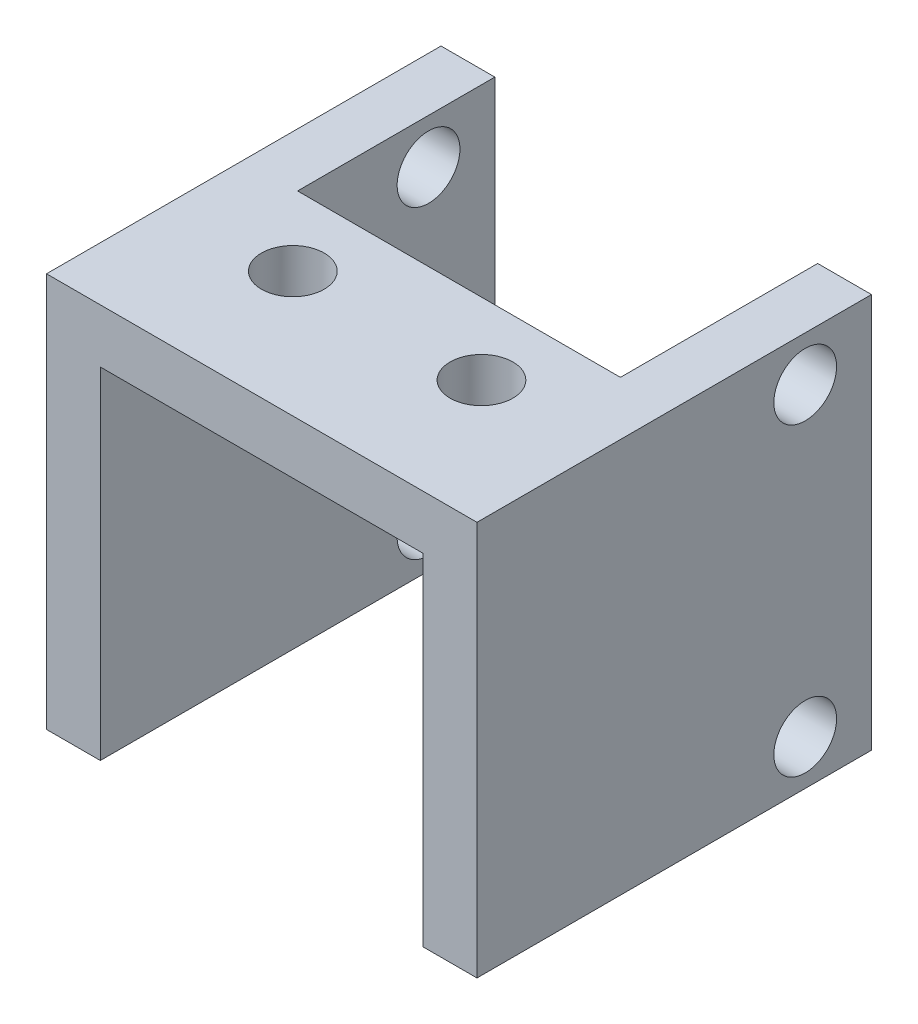
ISO-10303-21;
HEADER;
FILE_DESCRIPTION(('STEP AP214'),'2;1');
FILE_NAME('part.step','',(''),(''),'','','');
FILE_SCHEMA(('AUTOMOTIVE_DESIGN { 1 0 10303 214 1 1 1 1 }'));
ENDSEC;
DATA;
#1=APPLICATION_CONTEXT('core data for automotive mechanical design processes');
#2=APPLICATION_PROTOCOL_DEFINITION('international standard','automotive_design',2000,#1);
#3=PRODUCT_CONTEXT('',#1,'mechanical');
#4=PRODUCT('Part','Part','',(#3));
#5=PRODUCT_RELATED_PRODUCT_CATEGORY('part','',(#4));
#6=PRODUCT_DEFINITION_FORMATION('','',#4);
#7=PRODUCT_DEFINITION_CONTEXT('part definition',#1,'design');
#8=PRODUCT_DEFINITION('design','',#6,#7);
#9=PRODUCT_DEFINITION_SHAPE('','',#8);
#10=(LENGTH_UNIT() NAMED_UNIT(*) SI_UNIT(.MILLI.,.METRE.));
#11=(NAMED_UNIT(*) PLANE_ANGLE_UNIT() SI_UNIT($,.RADIAN.));
#12=(NAMED_UNIT(*) SI_UNIT($,.STERADIAN.) SOLID_ANGLE_UNIT());
#13=UNCERTAINTY_MEASURE_WITH_UNIT(LENGTH_MEASURE(1.E-05),#10,'distance_accuracy_value','');
#14=(GEOMETRIC_REPRESENTATION_CONTEXT(3) GLOBAL_UNCERTAINTY_ASSIGNED_CONTEXT((#13)) GLOBAL_UNIT_ASSIGNED_CONTEXT((#10,
#11,#12)) REPRESENTATION_CONTEXT('',''));
#15=CARTESIAN_POINT('',(0.,0.,0.));
#16=DIRECTION('',(0.,0.,1.));
#17=DIRECTION('',(1.,0.,0.));
#18=AXIS2_PLACEMENT_3D('',#15,#16,#17);
#19=CARTESIAN_POINT('',(0.,0.,-15.30483348));
#20=DIRECTION('',(0.,0.,1.));
#21=DIRECTION('',(1.,0.,0.));
#22=AXIS2_PLACEMENT_3D('',#19,#20,#21);
#23=PLANE('',#22);
#24=DIRECTION('',(0.,1.,0.));
#25=VECTOR('',#24,1.);
#26=CARTESIAN_POINT('',(9.00000000009112,0.,-15.30483348));
#27=LINE('',#26,#25);
#28=CARTESIAN_POINT('',(9.00000000009112,-2.999999996,-15.3048334800536));
#29=VERTEX_POINT('',#28);
#30=CARTESIAN_POINT('',(9.00000000002565,0.,-15.30483348));
#31=VERTEX_POINT('',#30);
#32=EDGE_CURVE('E11',#29,#31,#27,.T.);
#33=ORIENTED_EDGE('',*,*,#32,.F.);
#34=DIRECTION('',(1.,0.,0.));
#35=VECTOR('',#34,1.);
#36=CARTESIAN_POINT('',(-8.99726579,-2.999999996,-15.30483348));
#37=LINE('',#36,#35);
#38=CARTESIAN_POINT('',(-8.99726579,-2.999999996,-15.30483348));
#39=VERTEX_POINT('',#38);
#40=EDGE_CURVE('E144',#39,#29,#37,.T.);
#41=ORIENTED_EDGE('',*,*,#40,.F.);
#42=DIRECTION('',(0.,-1.,0.));
#43=VECTOR('',#42,1.);
#44=CARTESIAN_POINT('',(-8.99726579,0.,-15.30483348));
#45=LINE('',#44,#43);
#46=CARTESIAN_POINT('',(-8.99726579,0.,-15.30483348));
#47=VERTEX_POINT('',#46);
#48=EDGE_CURVE('E148',#47,#39,#45,.T.);
#49=ORIENTED_EDGE('',*,*,#48,.F.);
#50=DIRECTION('',(-1.,0.,0.));
#51=VECTOR('',#50,1.);
#52=CARTESIAN_POINT('',(12.,0.,-15.30483348));
#53=LINE('',#52,#51);
#54=EDGE_CURVE('E154',#31,#47,#53,.T.);
#55=ORIENTED_EDGE('',*,*,#54,.F.);
#56=EDGE_LOOP('',(#33,#41,#49,#55));
#57=FACE_BOUND('',#56,.T.);
#58=ADVANCED_FACE('F33',(#57),#23,.F.);
#59=CARTESIAN_POINT('',(-8.99726579179765,0.,-4.30875225));
#60=DIRECTION('',(0.,1.,0.));
#61=DIRECTION('',(0.,0.,1.));
#62=AXIS2_PLACEMENT_3D('',#59,#60,#61);
#63=PLANE('',#62);
#64=CARTESIAN_POINT('',(-5.258745872,0.,-11.300890987));
#65=DIRECTION('',(0.,1.,0.));
#66=DIRECTION('',(0.,0.,1.));
#67=AXIS2_PLACEMENT_3D('',#64,#65,#66);
#68=CIRCLE('',#67,1.74999999999999);
#69=CARTESIAN_POINT('',(-5.258745872,0.,-9.55089098700001));
#70=VERTEX_POINT('',#69);
#71=EDGE_CURVE('E293',#70,#70,#68,.T.);
#72=ORIENTED_EDGE('',*,*,#71,.F.);
#73=EDGE_LOOP('',(#72));
#74=FACE_BOUND('',#73,.T.);
#75=CARTESIAN_POINT('',(5.258745872,0.,-11.300890987));
#76=DIRECTION('',(0.,1.,0.));
#77=DIRECTION('',(0.,0.,1.));
#78=AXIS2_PLACEMENT_3D('',#75,#76,#77);
#79=CIRCLE('',#78,1.74999999999999);
#80=CARTESIAN_POINT('',(5.258745872,0.,-9.55089098700001));
#81=VERTEX_POINT('',#80);
#82=EDGE_CURVE('E137',#81,#81,#79,.T.);
#83=ORIENTED_EDGE('',*,*,#82,.F.);
#84=EDGE_LOOP('',(#83));
#85=FACE_BOUND('',#84,.T.);
#86=DIRECTION('',(0.,0.,-1.));
#87=VECTOR('',#86,1.);
#88=CARTESIAN_POINT('',(-11.99726579,0.,-4.30875225));
#89=LINE('',#88,#87);
#90=CARTESIAN_POINT('',(-11.99726579,0.,-4.30875225));
#91=VERTEX_POINT('',#90);
#92=CARTESIAN_POINT('',(-11.99726579,0.,-26.300914709));
#93=VERTEX_POINT('',#92);
#94=EDGE_CURVE('E121',#91,#93,#89,.T.);
#95=ORIENTED_EDGE('',*,*,#94,.F.);
#96=DIRECTION('',(-1.,0.,0.));
#97=VECTOR('',#96,1.);
#98=CARTESIAN_POINT('',(-8.99726579179765,0.,-4.30875225));
#99=LINE('',#98,#97);
#100=CARTESIAN_POINT('',(12.,0.,-4.308752250375));
#101=VERTEX_POINT('',#100);
#102=EDGE_CURVE('E41',#101,#91,#99,.T.);
#103=ORIENTED_EDGE('',*,*,#102,.F.);
#104=DIRECTION('',(0.,0.,1.));
#105=VECTOR('',#104,1.);
#106=CARTESIAN_POINT('',(12.,0.,-15.30483348));
#107=LINE('',#106,#105);
#108=CARTESIAN_POINT('',(12.0000000000257,0.,-26.3009147093214));
#109=VERTEX_POINT('',#108);
#110=EDGE_CURVE('E147',#109,#101,#107,.T.);
#111=ORIENTED_EDGE('',*,*,#110,.F.);
#112=DIRECTION('',(1.,0.,-5.95299272839375E-12));
#113=VECTOR('',#112,1.);
#114=CARTESIAN_POINT('',(12.0000000000257,0.,-26.3009147093214));
#115=LINE('',#114,#113);
#116=CARTESIAN_POINT('',(9.00000000002565,0.,-26.3009147093036));
#117=VERTEX_POINT('',#116);
#118=EDGE_CURVE('E133',#117,#109,#115,.T.);
#119=ORIENTED_EDGE('',*,*,#118,.F.);
#120=DIRECTION('',(5.95310697820905E-12,0.,1.));
#121=VECTOR('',#120,1.);
#122=CARTESIAN_POINT('',(9.00000000002565,0.,-26.3009147093036));
#123=LINE('',#122,#121);
#124=EDGE_CURVE('E48',#117,#31,#123,.T.);
#125=ORIENTED_EDGE('',*,*,#124,.T.);
#126=ORIENTED_EDGE('',*,*,#54,.T.);
#127=DIRECTION('',(0.,0.,-1.));
#128=VECTOR('',#127,1.);
#129=CARTESIAN_POINT('',(-8.99726579179765,0.,-4.30875225));
#130=LINE('',#129,#128);
#131=CARTESIAN_POINT('',(-8.99726579179765,0.,-26.300914709));
#132=VERTEX_POINT('',#131);
#133=EDGE_CURVE('E177',#47,#132,#130,.T.);
#134=ORIENTED_EDGE('',*,*,#133,.T.);
#135=DIRECTION('',(-1.,0.,0.));
#136=VECTOR('',#135,1.);
#137=CARTESIAN_POINT('',(-8.99726579179765,0.,-26.300914709));
#138=LINE('',#137,#136);
#139=EDGE_CURVE('E196',#132,#93,#138,.T.);
#140=ORIENTED_EDGE('',*,*,#139,.T.);
#141=EDGE_LOOP('',(#95,#103,#111,#119,#125,#126,#134,#140));
#142=FACE_BOUND('',#141,.T.);
#143=ADVANCED_FACE('F35',(#74,#85,#142),#63,.T.);
#144=CARTESIAN_POINT('',(-8.99726579179765,-22.,-4.30875225));
#145=DIRECTION('',(0.,0.,1.));
#146=DIRECTION('',(1.,0.,0.));
#147=AXIS2_PLACEMENT_3D('',#144,#145,#146);
#148=PLANE('',#147);
#149=DIRECTION('',(0.,1.,0.));
#150=VECTOR('',#149,1.);
#151=CARTESIAN_POINT('',(-11.99726579,-22.,-4.30875225));
#152=LINE('',#151,#150);
#153=CARTESIAN_POINT('',(-11.99726579,-22.,-4.30875225));
#154=VERTEX_POINT('',#153);
#155=EDGE_CURVE('E187',#154,#91,#152,.T.);
#156=ORIENTED_EDGE('',*,*,#155,.F.);
#157=DIRECTION('',(-1.,0.,0.));
#158=VECTOR('',#157,1.);
#159=CARTESIAN_POINT('',(-8.99726579179765,-22.,-4.30875225));
#160=LINE('',#159,#158);
#161=CARTESIAN_POINT('',(-8.99726579179765,-22.,-4.30875225));
#162=VERTEX_POINT('',#161);
#163=EDGE_CURVE('E213',#162,#154,#160,.T.);
#164=ORIENTED_EDGE('',*,*,#163,.F.);
#165=DIRECTION('',(0.,1.,0.));
#166=VECTOR('',#165,1.);
#167=CARTESIAN_POINT('',(-8.99726579179765,-22.,-4.30875225));
#168=LINE('',#167,#166);
#169=CARTESIAN_POINT('',(-8.99726579179765,-2.999999996,-4.30875225));
#170=VERTEX_POINT('',#169);
#171=EDGE_CURVE('E198',#162,#170,#168,.T.);
#172=ORIENTED_EDGE('',*,*,#171,.T.);
#173=DIRECTION('',(1.,0.,0.));
#174=VECTOR('',#173,1.);
#175=CARTESIAN_POINT('',(-8.99726579,-2.999999996,-4.308752250375));
#176=LINE('',#175,#174);
#177=CARTESIAN_POINT('',(9.,-2.999999996,-4.308752250375));
#178=VERTEX_POINT('',#177);
#179=EDGE_CURVE('E55',#170,#178,#176,.T.);
#180=ORIENTED_EDGE('',*,*,#179,.T.);
#181=DIRECTION('',(0.,-1.,0.));
#182=VECTOR('',#181,1.);
#183=CARTESIAN_POINT('',(9.,-2.999999996,-4.308752250375));
#184=LINE('',#183,#182);
#185=CARTESIAN_POINT('',(9.,-21.999999998,-4.308752250375));
#186=VERTEX_POINT('',#185);
#187=EDGE_CURVE('E150',#178,#186,#184,.T.);
#188=ORIENTED_EDGE('',*,*,#187,.T.);
#189=DIRECTION('',(1.,0.,0.));
#190=VECTOR('',#189,1.);
#191=CARTESIAN_POINT('',(9.,-21.999999998,-4.308752250375));
#192=LINE('',#191,#190);
#193=CARTESIAN_POINT('',(12.,-21.999999998,-4.308752250375));
#194=VERTEX_POINT('',#193);
#195=EDGE_CURVE('E153',#186,#194,#192,.T.);
#196=ORIENTED_EDGE('',*,*,#195,.T.);
#197=DIRECTION('',(0.,1.,0.));
#198=VECTOR('',#197,1.);
#199=CARTESIAN_POINT('',(12.,-21.999999998,-4.308752250375));
#200=LINE('',#199,#198);
#201=EDGE_CURVE('E117',#194,#101,#200,.T.);
#202=ORIENTED_EDGE('',*,*,#201,.T.);
#203=ORIENTED_EDGE('',*,*,#102,.T.);
#204=EDGE_LOOP('',(#156,#164,#172,#180,#188,#196,#202,#203));
#205=FACE_BOUND('',#204,.T.);
#206=ADVANCED_FACE('F222',(#205),#148,.T.);
#207=CARTESIAN_POINT('',(-8.99726579179765,-22.,-26.300914709));
#208=DIRECTION('',(0.,-1.,0.));
#209=DIRECTION('',(0.,0.,-1.));
#210=AXIS2_PLACEMENT_3D('',#207,#208,#209);
#211=PLANE('',#210);
#212=DIRECTION('',(0.,0.,1.));
#213=VECTOR('',#212,1.);
#214=CARTESIAN_POINT('',(-11.99726579,-22.,-26.300914709));
#215=LINE('',#214,#213);
#216=CARTESIAN_POINT('',(-11.99726579,-22.,-26.300914709));
#217=VERTEX_POINT('',#216);
#218=EDGE_CURVE('E192',#217,#154,#215,.T.);
#219=ORIENTED_EDGE('',*,*,#218,.F.);
#220=DIRECTION('',(-1.,0.,0.));
#221=VECTOR('',#220,1.);
#222=CARTESIAN_POINT('',(-8.99726579179765,-22.,-26.300914709));
#223=LINE('',#222,#221);
#224=CARTESIAN_POINT('',(-8.99726579179765,-22.,-26.300914709));
#225=VERTEX_POINT('',#224);
#226=EDGE_CURVE('E214',#225,#217,#223,.T.);
#227=ORIENTED_EDGE('',*,*,#226,.F.);
#228=DIRECTION('',(0.,0.,1.));
#229=VECTOR('',#228,1.);
#230=CARTESIAN_POINT('',(-8.99726579179765,-22.,-26.300914709));
#231=LINE('',#230,#229);
#232=EDGE_CURVE('E189',#225,#162,#231,.T.);
#233=ORIENTED_EDGE('',*,*,#232,.T.);
#234=ORIENTED_EDGE('',*,*,#163,.T.);
#235=EDGE_LOOP('',(#219,#227,#233,#234));
#236=FACE_BOUND('',#235,.T.);
#237=ADVANCED_FACE('F231',(#236),#211,.T.);
#238=CARTESIAN_POINT('',(-8.99726579179765,0.,-26.300914709));
#239=DIRECTION('',(0.,0.,-1.));
#240=DIRECTION('',(-1.,0.,0.));
#241=AXIS2_PLACEMENT_3D('',#238,#239,#240);
#242=PLANE('',#241);
#243=DIRECTION('',(0.,-1.,0.));
#244=VECTOR('',#243,1.);
#245=CARTESIAN_POINT('',(-11.99726579,0.,-26.300914709));
#246=LINE('',#245,#244);
#247=EDGE_CURVE('E207',#93,#217,#246,.T.);
#248=ORIENTED_EDGE('',*,*,#247,.F.);
#249=ORIENTED_EDGE('',*,*,#139,.F.);
#250=DIRECTION('',(0.,-1.,0.));
#251=VECTOR('',#250,1.);
#252=CARTESIAN_POINT('',(-8.99726579179765,0.,-26.300914709));
#253=LINE('',#252,#251);
#254=EDGE_CURVE('E186',#132,#225,#253,.T.);
#255=ORIENTED_EDGE('',*,*,#254,.T.);
#256=ORIENTED_EDGE('',*,*,#226,.T.);
#257=EDGE_LOOP('',(#248,#249,#255,#256));
#258=FACE_BOUND('',#257,.T.);
#259=ADVANCED_FACE('F233',(#258),#242,.T.);
#260=CARTESIAN_POINT('',(-8.99726579179765,0.,0.));
#261=DIRECTION('',(-1.,0.,0.));
#262=DIRECTION('',(0.,0.,1.));
#263=AXIS2_PLACEMENT_3D('',#260,#261,#262);
#264=PLANE('',#263);
#265=CARTESIAN_POINT('',(-8.99726579179765,-19.5,-22.606276953));
#266=DIRECTION('',(1.,0.,0.));
#267=DIRECTION('',(0.,0.,-1.));
#268=AXIS2_PLACEMENT_3D('',#265,#266,#267);
#269=CIRCLE('',#268,1.74999999999998);
#270=CARTESIAN_POINT('',(-8.99726579179765,-19.5,-24.356276953));
#271=VERTEX_POINT('',#270);
#272=EDGE_CURVE('E332',#271,#271,#269,.T.);
#273=ORIENTED_EDGE('',*,*,#272,.F.);
#274=EDGE_LOOP('',(#273));
#275=FACE_BOUND('',#274,.T.);
#276=CARTESIAN_POINT('',(-8.99726579179765,-2.5,-22.606276953));
#277=DIRECTION('',(1.,0.,0.));
#278=DIRECTION('',(0.,0.,-1.));
#279=AXIS2_PLACEMENT_3D('',#276,#277,#278);
#280=CIRCLE('',#279,1.74999999999999);
#281=CARTESIAN_POINT('',(-8.99726579179765,-2.5,-24.356276953));
#282=VERTEX_POINT('',#281);
#283=EDGE_CURVE('E276',#282,#282,#280,.T.);
#284=ORIENTED_EDGE('',*,*,#283,.F.);
#285=EDGE_LOOP('',(#284));
#286=FACE_BOUND('',#285,.T.);
#287=ORIENTED_EDGE('',*,*,#133,.F.);
#288=ORIENTED_EDGE('',*,*,#48,.T.);
#289=DIRECTION('',(0.,0.,1.));
#290=VECTOR('',#289,1.);
#291=CARTESIAN_POINT('',(-8.99726579,-2.999999996,-15.30483348));
#292=LINE('',#291,#290);
#293=EDGE_CURVE('E159',#39,#170,#292,.T.);
#294=ORIENTED_EDGE('',*,*,#293,.T.);
#295=ORIENTED_EDGE('',*,*,#171,.F.);
#296=ORIENTED_EDGE('',*,*,#232,.F.);
#297=ORIENTED_EDGE('',*,*,#254,.F.);
#298=EDGE_LOOP('',(#287,#288,#294,#295,#296,#297));
#299=FACE_BOUND('',#298,.T.);
#300=ADVANCED_FACE('F183',(#275,#286,#299),#264,.F.);
#301=CARTESIAN_POINT('',(-11.99726579,0.,0.));
#302=DIRECTION('',(-1.,0.,0.));
#303=DIRECTION('',(0.,0.,1.));
#304=AXIS2_PLACEMENT_3D('',#301,#302,#303);
#305=PLANE('',#304);
#306=CARTESIAN_POINT('',(-11.99726579,-19.5,-22.606276953));
#307=DIRECTION('',(1.,0.,0.));
#308=DIRECTION('',(0.,0.,-1.));
#309=AXIS2_PLACEMENT_3D('',#306,#307,#308);
#310=CIRCLE('',#309,1.74999999999998);
#311=CARTESIAN_POINT('',(-11.99726579,-19.5,-24.356276953));
#312=VERTEX_POINT('',#311);
#313=EDGE_CURVE('E270',#312,#312,#310,.T.);
#314=ORIENTED_EDGE('',*,*,#313,.T.);
#315=EDGE_LOOP('',(#314));
#316=FACE_BOUND('',#315,.T.);
#317=CARTESIAN_POINT('',(-11.99726579,-2.5,-22.606276953));
#318=DIRECTION('',(1.,0.,0.));
#319=DIRECTION('',(0.,0.,-1.));
#320=AXIS2_PLACEMENT_3D('',#317,#318,#319);
#321=CIRCLE('',#320,1.74999999999999);
#322=CARTESIAN_POINT('',(-11.99726579,-2.5,-24.356276953));
#323=VERTEX_POINT('',#322);
#324=EDGE_CURVE('E273',#323,#323,#321,.T.);
#325=ORIENTED_EDGE('',*,*,#324,.T.);
#326=EDGE_LOOP('',(#325));
#327=FACE_BOUND('',#326,.T.);
#328=ORIENTED_EDGE('',*,*,#94,.T.);
#329=ORIENTED_EDGE('',*,*,#247,.T.);
#330=ORIENTED_EDGE('',*,*,#218,.T.);
#331=ORIENTED_EDGE('',*,*,#155,.T.);
#332=EDGE_LOOP('',(#328,#329,#330,#331));
#333=FACE_BOUND('',#332,.T.);
#334=ADVANCED_FACE('F229',(#316,#327,#333),#305,.T.);
#335=CARTESIAN_POINT('',(12.,-21.999999998,-15.30483348));
#336=DIRECTION('',(1.,0.,0.));
#337=DIRECTION('',(0.,1.,0.));
#338=AXIS2_PLACEMENT_3D('',#335,#336,#337);
#339=PLANE('',#338);
#340=CARTESIAN_POINT('',(12.0000000000911,-19.5,-22.606276953));
#341=DIRECTION('',(-1.,0.,0.));
#342=DIRECTION('',(0.,0.,1.));
#343=AXIS2_PLACEMENT_3D('',#340,#341,#342);
#344=CIRCLE('',#343,1.74999999999998);
#345=CARTESIAN_POINT('',(12.0000000000911,-19.5,-20.856276953));
#346=VERTEX_POINT('',#345);
#347=EDGE_CURVE('E279',#346,#346,#344,.T.);
#348=ORIENTED_EDGE('',*,*,#347,.T.);
#349=EDGE_LOOP('',(#348));
#350=FACE_BOUND('',#349,.T.);
#351=CARTESIAN_POINT('',(12.0000000000911,-2.5,-22.606276953));
#352=DIRECTION('',(-1.,0.,0.));
#353=DIRECTION('',(0.,0.,1.));
#354=AXIS2_PLACEMENT_3D('',#351,#352,#353);
#355=CIRCLE('',#354,1.74999999999999);
#356=CARTESIAN_POINT('',(12.0000000000911,-2.5,-20.856276953));
#357=VERTEX_POINT('',#356);
#358=EDGE_CURVE('E290',#357,#357,#355,.T.);
#359=ORIENTED_EDGE('',*,*,#358,.T.);
#360=EDGE_LOOP('',(#359));
#361=FACE_BOUND('',#360,.T.);
#362=ORIENTED_EDGE('',*,*,#201,.F.);
#363=DIRECTION('',(0.,0.,1.));
#364=VECTOR('',#363,1.);
#365=CARTESIAN_POINT('',(12.,-21.999999998,-15.30483348));
#366=LINE('',#365,#364);
#367=CARTESIAN_POINT('',(12.0000000000257,-22.,-26.3009147093214));
#368=VERTEX_POINT('',#367);
#369=EDGE_CURVE('E110',#368,#194,#366,.T.);
#370=ORIENTED_EDGE('',*,*,#369,.F.);
#371=DIRECTION('',(0.,-1.,0.));
#372=VECTOR('',#371,1.);
#373=CARTESIAN_POINT('',(12.0000000000257,-22.,-26.3009147093214));
#374=LINE('',#373,#372);
#375=EDGE_CURVE('E115',#109,#368,#374,.T.);
#376=ORIENTED_EDGE('',*,*,#375,.F.);
#377=ORIENTED_EDGE('',*,*,#110,.T.);
#378=EDGE_LOOP('',(#362,#370,#376,#377));
#379=FACE_BOUND('',#378,.T.);
#380=ADVANCED_FACE('F112',(#350,#361,#379),#339,.T.);
#381=CARTESIAN_POINT('',(9.,-21.999999998,-15.30483348));
#382=DIRECTION('',(0.,-1.,0.));
#383=DIRECTION('',(0.,0.,-1.));
#384=AXIS2_PLACEMENT_3D('',#381,#382,#383);
#385=PLANE('',#384);
#386=ORIENTED_EDGE('',*,*,#195,.F.);
#387=DIRECTION('',(0.,0.,1.));
#388=VECTOR('',#387,1.);
#389=CARTESIAN_POINT('',(9.,-21.999999998,-15.30483348));
#390=LINE('',#389,#388);
#391=CARTESIAN_POINT('',(9.00000000002565,-22.,-26.3009147093036));
#392=VERTEX_POINT('',#391);
#393=EDGE_CURVE('E122',#392,#186,#390,.T.);
#394=ORIENTED_EDGE('',*,*,#393,.F.);
#395=DIRECTION('',(-1.,0.,5.95299272839374E-12));
#396=VECTOR('',#395,1.);
#397=CARTESIAN_POINT('',(9.00000000002565,-22.,-26.3009147093036));
#398=LINE('',#397,#396);
#399=EDGE_CURVE('E125',#368,#392,#398,.T.);
#400=ORIENTED_EDGE('',*,*,#399,.F.);
#401=ORIENTED_EDGE('',*,*,#369,.T.);
#402=EDGE_LOOP('',(#386,#394,#400,#401));
#403=FACE_BOUND('',#402,.T.);
#404=ADVANCED_FACE('F126',(#403),#385,.T.);
#405=CARTESIAN_POINT('',(9.,-2.999999996,-15.30483348));
#406=DIRECTION('',(-1.,0.,0.));
#407=DIRECTION('',(0.,-1.,0.));
#408=AXIS2_PLACEMENT_3D('',#405,#406,#407);
#409=PLANE('',#408);
#410=CARTESIAN_POINT('',(9.,-19.5,-22.606276953));
#411=DIRECTION('',(-1.,0.,0.));
#412=DIRECTION('',(0.,0.,1.));
#413=AXIS2_PLACEMENT_3D('',#410,#411,#412);
#414=CIRCLE('',#413,1.74999999999998);
#415=CARTESIAN_POINT('',(9.,-19.5,-20.856276953));
#416=VERTEX_POINT('',#415);
#417=EDGE_CURVE('E275',#416,#416,#414,.T.);
#418=ORIENTED_EDGE('',*,*,#417,.F.);
#419=EDGE_LOOP('',(#418));
#420=FACE_BOUND('',#419,.T.);
#421=CARTESIAN_POINT('',(9.,-2.5,-22.606276953));
#422=DIRECTION('',(-1.,0.,0.));
#423=DIRECTION('',(0.,0.,1.));
#424=AXIS2_PLACEMENT_3D('',#421,#422,#423);
#425=CIRCLE('',#424,1.74999999999999);
#426=CARTESIAN_POINT('',(9.,-2.5,-20.856276953));
#427=VERTEX_POINT('',#426);
#428=EDGE_CURVE('E287',#427,#427,#425,.T.);
#429=ORIENTED_EDGE('',*,*,#428,.F.);
#430=EDGE_LOOP('',(#429));
#431=FACE_BOUND('',#430,.T.);
#432=ORIENTED_EDGE('',*,*,#187,.F.);
#433=DIRECTION('',(0.,0.,1.));
#434=VECTOR('',#433,1.);
#435=CARTESIAN_POINT('',(9.,-2.999999996,-15.30483348));
#436=LINE('',#435,#434);
#437=EDGE_CURVE('E157',#29,#178,#436,.T.);
#438=ORIENTED_EDGE('',*,*,#437,.F.);
#439=ORIENTED_EDGE('',*,*,#32,.T.);
#440=ORIENTED_EDGE('',*,*,#124,.F.);
#441=DIRECTION('',(0.,1.,0.));
#442=VECTOR('',#441,1.);
#443=CARTESIAN_POINT('',(9.00000000002565,0.,-26.3009147093036));
#444=LINE('',#443,#442);
#445=EDGE_CURVE('E129',#392,#117,#444,.T.);
#446=ORIENTED_EDGE('',*,*,#445,.F.);
#447=ORIENTED_EDGE('',*,*,#393,.T.);
#448=EDGE_LOOP('',(#432,#438,#439,#440,#446,#447));
#449=FACE_BOUND('',#448,.T.);
#450=ADVANCED_FACE('F227',(#420,#431,#449),#409,.T.);
#451=CARTESIAN_POINT('',(-8.99726579,-2.999999996,-15.30483348));
#452=DIRECTION('',(0.,-1.,0.));
#453=DIRECTION('',(0.,0.,-1.));
#454=AXIS2_PLACEMENT_3D('',#451,#452,#453);
#455=PLANE('',#454);
#456=CARTESIAN_POINT('',(-5.258745872,-2.999999996,-11.300890987));
#457=DIRECTION('',(0.,-1.,0.));
#458=DIRECTION('',(0.,0.,-1.));
#459=AXIS2_PLACEMENT_3D('',#456,#457,#458);
#460=CIRCLE('',#459,1.74999999999999);
#461=CARTESIAN_POINT('',(-5.258745872,-2.999999996,-13.050890987));
#462=VERTEX_POINT('',#461);
#463=EDGE_CURVE('E296',#462,#462,#460,.T.);
#464=ORIENTED_EDGE('',*,*,#463,.F.);
#465=EDGE_LOOP('',(#464));
#466=FACE_BOUND('',#465,.T.);
#467=CARTESIAN_POINT('',(5.258745872,-2.999999996,-11.300890987));
#468=DIRECTION('',(0.,-1.,0.));
#469=DIRECTION('',(0.,0.,-1.));
#470=AXIS2_PLACEMENT_3D('',#467,#468,#469);
#471=CIRCLE('',#470,1.74999999999999);
#472=CARTESIAN_POINT('',(5.258745872,-2.999999996,-13.050890987));
#473=VERTEX_POINT('',#472);
#474=EDGE_CURVE('E134',#473,#473,#471,.T.);
#475=ORIENTED_EDGE('',*,*,#474,.F.);
#476=EDGE_LOOP('',(#475));
#477=FACE_BOUND('',#476,.T.);
#478=ORIENTED_EDGE('',*,*,#179,.F.);
#479=ORIENTED_EDGE('',*,*,#293,.F.);
#480=ORIENTED_EDGE('',*,*,#40,.T.);
#481=ORIENTED_EDGE('',*,*,#437,.T.);
#482=EDGE_LOOP('',(#478,#479,#480,#481));
#483=FACE_BOUND('',#482,.T.);
#484=ADVANCED_FACE('F223',(#466,#477,#483),#455,.T.);
#485=CARTESIAN_POINT('',(-1.56570410314519E-10,0.,-26.30091470925));
#486=DIRECTION('',(5.95299272839375E-12,0.,1.));
#487=DIRECTION('',(1.,0.,-5.95299272839375E-12));
#488=AXIS2_PLACEMENT_3D('',#485,#486,#487);
#489=PLANE('',#488);
#490=ORIENTED_EDGE('',*,*,#375,.T.);
#491=ORIENTED_EDGE('',*,*,#399,.T.);
#492=ORIENTED_EDGE('',*,*,#445,.T.);
#493=ORIENTED_EDGE('',*,*,#118,.T.);
#494=EDGE_LOOP('',(#490,#491,#492,#493));
#495=FACE_BOUND('',#494,.T.);
#496=ADVANCED_FACE('F132',(#495),#489,.F.);
#497=CARTESIAN_POINT('',(5.258745872,0.,-11.300890987));
#498=DIRECTION('',(0.,1.,0.));
#499=DIRECTION('',(0.,0.,1.));
#500=AXIS2_PLACEMENT_3D('',#497,#498,#499);
#501=CYLINDRICAL_SURFACE('',#500,1.74999999999999);
#502=ORIENTED_EDGE('',*,*,#474,.T.);
#503=EDGE_LOOP('',(#502));
#504=FACE_BOUND('',#503,.T.);
#505=ORIENTED_EDGE('',*,*,#82,.T.);
#506=EDGE_LOOP('',(#505));
#507=FACE_BOUND('',#506,.T.);
#508=ADVANCED_FACE('F301',(#504,#507),#501,.F.);
#509=CARTESIAN_POINT('',(-5.258745872,0.,-11.300890987));
#510=DIRECTION('',(0.,1.,0.));
#511=DIRECTION('',(0.,0.,1.));
#512=AXIS2_PLACEMENT_3D('',#509,#510,#511);
#513=CYLINDRICAL_SURFACE('',#512,1.74999999999999);
#514=ORIENTED_EDGE('',*,*,#463,.T.);
#515=EDGE_LOOP('',(#514));
#516=FACE_BOUND('',#515,.T.);
#517=ORIENTED_EDGE('',*,*,#71,.T.);
#518=EDGE_LOOP('',(#517));
#519=FACE_BOUND('',#518,.T.);
#520=ADVANCED_FACE('F304',(#516,#519),#513,.F.);
#521=CARTESIAN_POINT('',(9.,-2.5,-22.606276953));
#522=DIRECTION('',(-1.,0.,0.));
#523=DIRECTION('',(0.,0.,1.));
#524=AXIS2_PLACEMENT_3D('',#521,#522,#523);
#525=CYLINDRICAL_SURFACE('',#524,1.74999999999999);
#526=ORIENTED_EDGE('',*,*,#358,.F.);
#527=EDGE_LOOP('',(#526));
#528=FACE_BOUND('',#527,.T.);
#529=ORIENTED_EDGE('',*,*,#428,.T.);
#530=EDGE_LOOP('',(#529));
#531=FACE_BOUND('',#530,.T.);
#532=ADVANCED_FACE('F310',(#528,#531),#525,.F.);
#533=CARTESIAN_POINT('',(9.,-19.5,-22.606276953));
#534=DIRECTION('',(-1.,0.,0.));
#535=DIRECTION('',(0.,0.,1.));
#536=AXIS2_PLACEMENT_3D('',#533,#534,#535);
#537=CYLINDRICAL_SURFACE('',#536,1.74999999999998);
#538=ORIENTED_EDGE('',*,*,#347,.F.);
#539=EDGE_LOOP('',(#538));
#540=FACE_BOUND('',#539,.T.);
#541=ORIENTED_EDGE('',*,*,#417,.T.);
#542=EDGE_LOOP('',(#541));
#543=FACE_BOUND('',#542,.T.);
#544=ADVANCED_FACE('F316',(#540,#543),#537,.F.);
#545=CARTESIAN_POINT('',(-8.99726579179765,-2.5,-22.606276953));
#546=DIRECTION('',(1.,0.,0.));
#547=DIRECTION('',(0.,0.,-1.));
#548=AXIS2_PLACEMENT_3D('',#545,#546,#547);
#549=CYLINDRICAL_SURFACE('',#548,1.74999999999999);
#550=ORIENTED_EDGE('',*,*,#324,.F.);
#551=EDGE_LOOP('',(#550));
#552=FACE_BOUND('',#551,.T.);
#553=ORIENTED_EDGE('',*,*,#283,.T.);
#554=EDGE_LOOP('',(#553));
#555=FACE_BOUND('',#554,.T.);
#556=ADVANCED_FACE('F320',(#552,#555),#549,.F.);
#557=CARTESIAN_POINT('',(-8.99726579179765,-19.5,-22.606276953));
#558=DIRECTION('',(1.,0.,0.));
#559=DIRECTION('',(0.,0.,-1.));
#560=AXIS2_PLACEMENT_3D('',#557,#558,#559);
#561=CYLINDRICAL_SURFACE('',#560,1.74999999999998);
#562=ORIENTED_EDGE('',*,*,#313,.F.);
#563=EDGE_LOOP('',(#562));
#564=FACE_BOUND('',#563,.T.);
#565=ORIENTED_EDGE('',*,*,#272,.T.);
#566=EDGE_LOOP('',(#565));
#567=FACE_BOUND('',#566,.T.);
#568=ADVANCED_FACE('F324',(#564,#567),#561,.F.);
#569=CLOSED_SHELL('',(#58,#143,#206,#237,#259,#300,#334,#380,#404,#450,#484,#496,#508,#520,#532,
#544,#556,#568));
#570=MANIFOLD_SOLID_BREP('B2',#569);
#571=ADVANCED_BREP_SHAPE_REPRESENTATION('',(#18,#570),#14);
#572=SHAPE_DEFINITION_REPRESENTATION(#9,#571);
ENDSEC;
END-ISO-10303-21;
